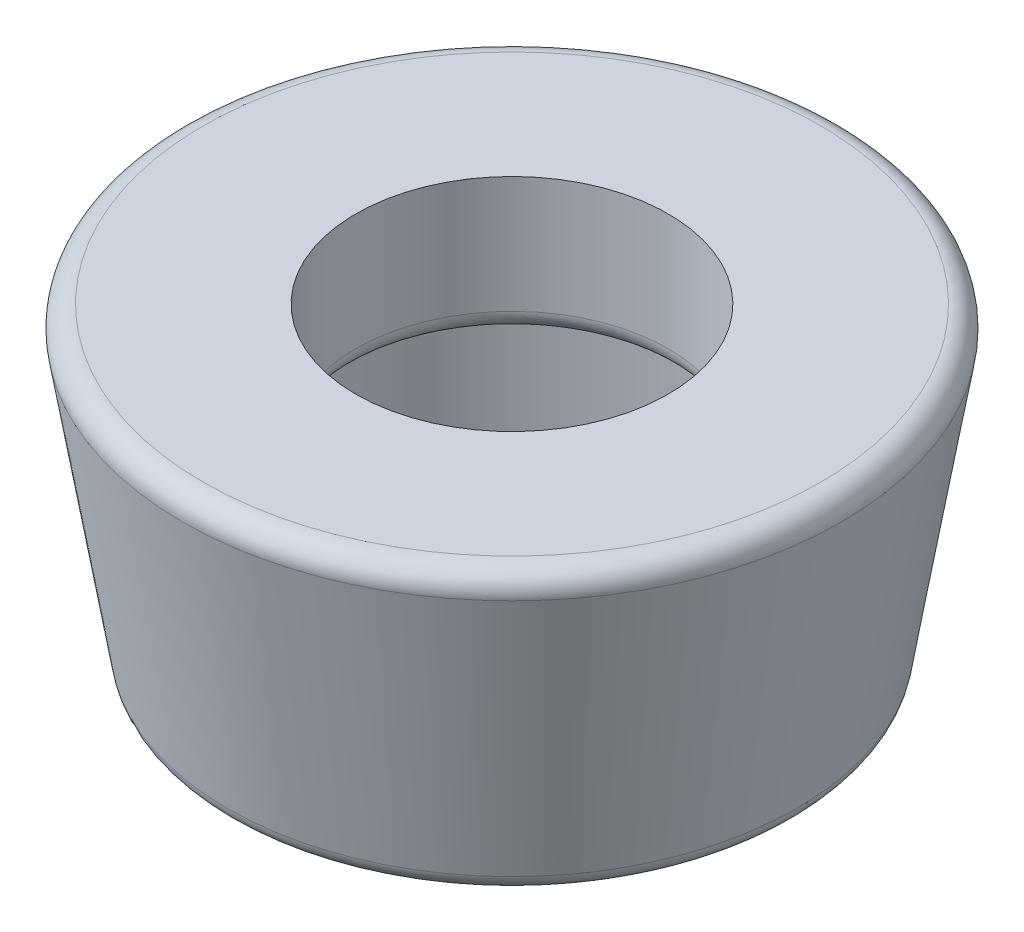
ISO-10303-21;
HEADER;
FILE_DESCRIPTION(('STEP AP214'),'2;1');
FILE_NAME('part.step','',(''),(''),'','','');
FILE_SCHEMA(('AUTOMOTIVE_DESIGN { 1 0 10303 214 1 1 1 1 }'));
ENDSEC;
DATA;
#1=APPLICATION_CONTEXT('core data for automotive mechanical design processes');
#2=APPLICATION_PROTOCOL_DEFINITION('international standard','automotive_design',2000,#1);
#3=PRODUCT_CONTEXT('',#1,'mechanical');
#4=PRODUCT('Part','Part','',(#3));
#5=PRODUCT_RELATED_PRODUCT_CATEGORY('part','',(#4));
#6=PRODUCT_DEFINITION_FORMATION('','',#4);
#7=PRODUCT_DEFINITION_CONTEXT('part definition',#1,'design');
#8=PRODUCT_DEFINITION('design','',#6,#7);
#9=PRODUCT_DEFINITION_SHAPE('','',#8);
#10=(LENGTH_UNIT() NAMED_UNIT(*) SI_UNIT(.MILLI.,.METRE.));
#11=(NAMED_UNIT(*) PLANE_ANGLE_UNIT() SI_UNIT($,.RADIAN.));
#12=(NAMED_UNIT(*) SI_UNIT($,.STERADIAN.) SOLID_ANGLE_UNIT());
#13=UNCERTAINTY_MEASURE_WITH_UNIT(LENGTH_MEASURE(1.E-05),#10,'distance_accuracy_value','');
#14=(GEOMETRIC_REPRESENTATION_CONTEXT(3) GLOBAL_UNCERTAINTY_ASSIGNED_CONTEXT((#13)) GLOBAL_UNIT_ASSIGNED_CONTEXT((#10,
#11,#12)) REPRESENTATION_CONTEXT('',''));
#15=CARTESIAN_POINT('',(0.,0.,0.));
#16=DIRECTION('',(0.,0.,1.));
#17=DIRECTION('',(1.,0.,0.));
#18=AXIS2_PLACEMENT_3D('',#15,#16,#17);
#19=CARTESIAN_POINT('',(0.,1.95544777432698,0.));
#20=DIRECTION('',(0.,1.,0.));
#21=DIRECTION('',(0.,0.,1.));
#22=AXIS2_PLACEMENT_3D('',#19,#20,#21);
#23=CYLINDRICAL_SURFACE('',#22,1.5);
#24=CARTESIAN_POINT('',(0.,-1.12133536952991,0.));
#25=DIRECTION('',(0.,1.,0.));
#26=DIRECTION('',(0.,0.,1.));
#27=AXIS2_PLACEMENT_3D('',#24,#25,#26);
#28=CIRCLE('',#27,1.5);
#29=CARTESIAN_POINT('',(0.,-1.12133536952991,1.5));
#30=VERTEX_POINT('',#29);
#31=EDGE_CURVE('E10',#30,#30,#28,.T.);
#32=ORIENTED_EDGE('',*,*,#31,.F.);
#33=EDGE_LOOP('',(#32));
#34=FACE_BOUND('',#33,.T.);
#35=CARTESIAN_POINT('',(0.,0.,0.));
#36=DIRECTION('',(0.,1.,0.));
#37=DIRECTION('',(0.,0.,1.));
#38=AXIS2_PLACEMENT_3D('',#35,#36,#37);
#39=CIRCLE('',#38,1.5);
#40=CARTESIAN_POINT('',(0.,0.,1.5));
#41=VERTEX_POINT('',#40);
#42=EDGE_CURVE('E61',#41,#41,#39,.T.);
#43=ORIENTED_EDGE('',*,*,#42,.T.);
#44=EDGE_LOOP('',(#43));
#45=FACE_BOUND('',#44,.T.);
#46=ADVANCED_FACE('F30',(#34,#45),#23,.F.);
#47=CARTESIAN_POINT('',(0.,-1.12133536952991,0.));
#48=DIRECTION('',(0.,1.,0.));
#49=DIRECTION('',(0.,0.,1.));
#50=AXIS2_PLACEMENT_3D('',#47,#48,#49);
#51=TOROIDAL_SURFACE('',#50,1.7,0.2);
#52=CARTESIAN_POINT('',(0.,-1.32133536952991,0.));
#53=DIRECTION('',(0.,1.,0.));
#54=DIRECTION('',(0.,0.,1.));
#55=AXIS2_PLACEMENT_3D('',#52,#53,#54);
#56=CIRCLE('',#55,1.7);
#57=CARTESIAN_POINT('',(0.,-1.32133536952991,1.7));
#58=VERTEX_POINT('',#57);
#59=EDGE_CURVE('E36',#58,#58,#56,.T.);
#60=ORIENTED_EDGE('',*,*,#59,.F.);
#61=EDGE_LOOP('',(#60));
#62=FACE_BOUND('',#61,.T.);
#63=ORIENTED_EDGE('',*,*,#31,.T.);
#64=EDGE_LOOP('',(#63));
#65=FACE_BOUND('',#64,.T.);
#66=ADVANCED_FACE('F104',(#62,#65),#51,.T.);
#67=CARTESIAN_POINT('',(1.7,-1.32133536952991,0.));
#68=DIRECTION('',(0.,1.,0.));
#69=DIRECTION('',(0.,0.,1.));
#70=AXIS2_PLACEMENT_3D('',#67,#68,#69);
#71=PLANE('',#70);
#72=CARTESIAN_POINT('',(0.,-1.32133536952991,0.));
#73=DIRECTION('',(0.,1.,0.));
#74=DIRECTION('',(0.,0.,1.));
#75=AXIS2_PLACEMENT_3D('',#72,#73,#74);
#76=CIRCLE('',#75,2.2);
#77=CARTESIAN_POINT('',(0.,-1.32133536952991,2.2));
#78=VERTEX_POINT('',#77);
#79=EDGE_CURVE('E40',#78,#78,#76,.T.);
#80=ORIENTED_EDGE('',*,*,#79,.F.);
#81=EDGE_LOOP('',(#80));
#82=FACE_BOUND('',#81,.T.);
#83=ORIENTED_EDGE('',*,*,#59,.T.);
#84=EDGE_LOOP('',(#83));
#85=FACE_BOUND('',#84,.T.);
#86=ADVANCED_FACE('F99',(#82,#85),#71,.F.);
#87=CARTESIAN_POINT('',(0.,1.95544777432698,0.));
#88=DIRECTION('',(0.,1.,0.));
#89=DIRECTION('',(0.,0.,1.));
#90=AXIS2_PLACEMENT_3D('',#87,#88,#89);
#91=CYLINDRICAL_SURFACE('',#90,2.2);
#92=CARTESIAN_POINT('',(0.,-3.,0.));
#93=DIRECTION('',(0.,1.,0.));
#94=DIRECTION('',(0.,0.,1.));
#95=AXIS2_PLACEMENT_3D('',#92,#93,#94);
#96=CIRCLE('',#95,2.2);
#97=CARTESIAN_POINT('',(0.,-3.,2.2));
#98=VERTEX_POINT('',#97);
#99=EDGE_CURVE('E44',#98,#98,#96,.T.);
#100=ORIENTED_EDGE('',*,*,#99,.F.);
#101=EDGE_LOOP('',(#100));
#102=FACE_BOUND('',#101,.T.);
#103=ORIENTED_EDGE('',*,*,#79,.T.);
#104=EDGE_LOOP('',(#103));
#105=FACE_BOUND('',#104,.T.);
#106=ADVANCED_FACE('F93',(#102,#105),#91,.F.);
#107=CARTESIAN_POINT('',(2.53057458232339,-3.,0.));
#108=DIRECTION('',(0.,1.,0.));
#109=DIRECTION('',(0.,0.,1.));
#110=AXIS2_PLACEMENT_3D('',#107,#108,#109);
#111=PLANE('',#110);
#112=CARTESIAN_POINT('',(0.,-3.,0.));
#113=DIRECTION('',(0.,1.,0.));
#114=DIRECTION('',(0.,0.,1.));
#115=AXIS2_PLACEMENT_3D('',#112,#113,#114);
#116=CIRCLE('',#115,2.53057458232339);
#117=CARTESIAN_POINT('',(0.,-3.,2.53057458232339));
#118=VERTEX_POINT('',#117);
#119=EDGE_CURVE('E49',#118,#118,#116,.T.);
#120=ORIENTED_EDGE('',*,*,#119,.F.);
#121=EDGE_LOOP('',(#120));
#122=FACE_BOUND('',#121,.T.);
#123=ORIENTED_EDGE('',*,*,#99,.T.);
#124=EDGE_LOOP('',(#123));
#125=FACE_BOUND('',#124,.T.);
#126=ADVANCED_FACE('F87',(#122,#125),#111,.F.);
#127=CARTESIAN_POINT('',(0.,-2.8,0.));
#128=DIRECTION('',(0.,1.,0.));
#129=DIRECTION('',(0.,0.,1.));
#130=AXIS2_PLACEMENT_3D('',#127,#128,#129);
#131=TOROIDAL_SURFACE('',#130,2.53057458232339,0.2);
#132=CARTESIAN_POINT('',(0.,-2.83287979746107,0.));
#133=DIRECTION('',(0.,1.,0.));
#134=DIRECTION('',(0.,0.,1.));
#135=AXIS2_PLACEMENT_3D('',#132,#133,#134);
#136=CIRCLE('',#135,2.72785336708982);
#137=CARTESIAN_POINT('',(0.,-2.83287979746107,2.72785336708982));
#138=VERTEX_POINT('',#137);
#139=EDGE_CURVE('E52',#138,#138,#136,.T.);
#140=ORIENTED_EDGE('',*,*,#139,.F.);
#141=EDGE_LOOP('',(#140));
#142=FACE_BOUND('',#141,.T.);
#143=ORIENTED_EDGE('',*,*,#119,.T.);
#144=EDGE_LOOP('',(#143));
#145=FACE_BOUND('',#144,.T.);
#146=ADVANCED_FACE('F81',(#142,#145),#131,.T.);
#147=CARTESIAN_POINT('',(0.,-2.83287979746107,0.));
#148=DIRECTION('',(0.,1.,0.));
#149=DIRECTION('',(0.,0.,1.));
#150=AXIS2_PLACEMENT_3D('',#147,#148,#149);
#151=CONICAL_SURFACE('',#150,2.72785336708982,0.165148677414627);
#152=CARTESIAN_POINT('',(0.,-0.232879797461073,0.));
#153=DIRECTION('',(0.,1.,0.));
#154=DIRECTION('',(0.,0.,1.));
#155=AXIS2_PLACEMENT_3D('',#152,#153,#154);
#156=CIRCLE('',#155,3.16118670042315);
#157=CARTESIAN_POINT('',(0.,-0.232879797461073,3.16118670042315));
#158=VERTEX_POINT('',#157);
#159=EDGE_CURVE('E55',#158,#158,#156,.T.);
#160=ORIENTED_EDGE('',*,*,#159,.F.);
#161=EDGE_LOOP('',(#160));
#162=FACE_BOUND('',#161,.T.);
#163=ORIENTED_EDGE('',*,*,#139,.T.);
#164=EDGE_LOOP('',(#163));
#165=FACE_BOUND('',#164,.T.);
#166=ADVANCED_FACE('F75',(#162,#165),#151,.T.);
#167=CARTESIAN_POINT('',(0.,-0.2,0.));
#168=DIRECTION('',(0.,1.,0.));
#169=DIRECTION('',(0.,0.,1.));
#170=AXIS2_PLACEMENT_3D('',#167,#168,#169);
#171=TOROIDAL_SURFACE('',#170,2.96390791565673,0.2);
#172=CARTESIAN_POINT('',(0.,0.,0.));
#173=DIRECTION('',(0.,1.,0.));
#174=DIRECTION('',(0.,0.,1.));
#175=AXIS2_PLACEMENT_3D('',#172,#173,#174);
#176=CIRCLE('',#175,2.96390791565672);
#177=CARTESIAN_POINT('',(0.,0.,2.96390791565672));
#178=VERTEX_POINT('',#177);
#179=EDGE_CURVE('E58',#178,#178,#176,.T.);
#180=ORIENTED_EDGE('',*,*,#179,.F.);
#181=EDGE_LOOP('',(#180));
#182=FACE_BOUND('',#181,.T.);
#183=ORIENTED_EDGE('',*,*,#159,.T.);
#184=EDGE_LOOP('',(#183));
#185=FACE_BOUND('',#184,.T.);
#186=ADVANCED_FACE('F69',(#182,#185),#171,.T.);
#187=CARTESIAN_POINT('',(1.5,0.,0.));
#188=DIRECTION('',(0.,-1.,0.));
#189=DIRECTION('',(0.,0.,-1.));
#190=AXIS2_PLACEMENT_3D('',#187,#188,#189);
#191=PLANE('',#190);
#192=ORIENTED_EDGE('',*,*,#42,.F.);
#193=EDGE_LOOP('',(#192));
#194=FACE_BOUND('',#193,.T.);
#195=ORIENTED_EDGE('',*,*,#179,.T.);
#196=EDGE_LOOP('',(#195));
#197=FACE_BOUND('',#196,.T.);
#198=ADVANCED_FACE('F66',(#194,#197),#191,.F.);
#199=CLOSED_SHELL('',(#46,#66,#86,#106,#126,#146,#166,#186,#198));
#200=MANIFOLD_SOLID_BREP('B2',#199);
#201=ADVANCED_BREP_SHAPE_REPRESENTATION('',(#18,#200),#14);
#202=SHAPE_DEFINITION_REPRESENTATION(#9,#201);
ENDSEC;
END-ISO-10303-21;
